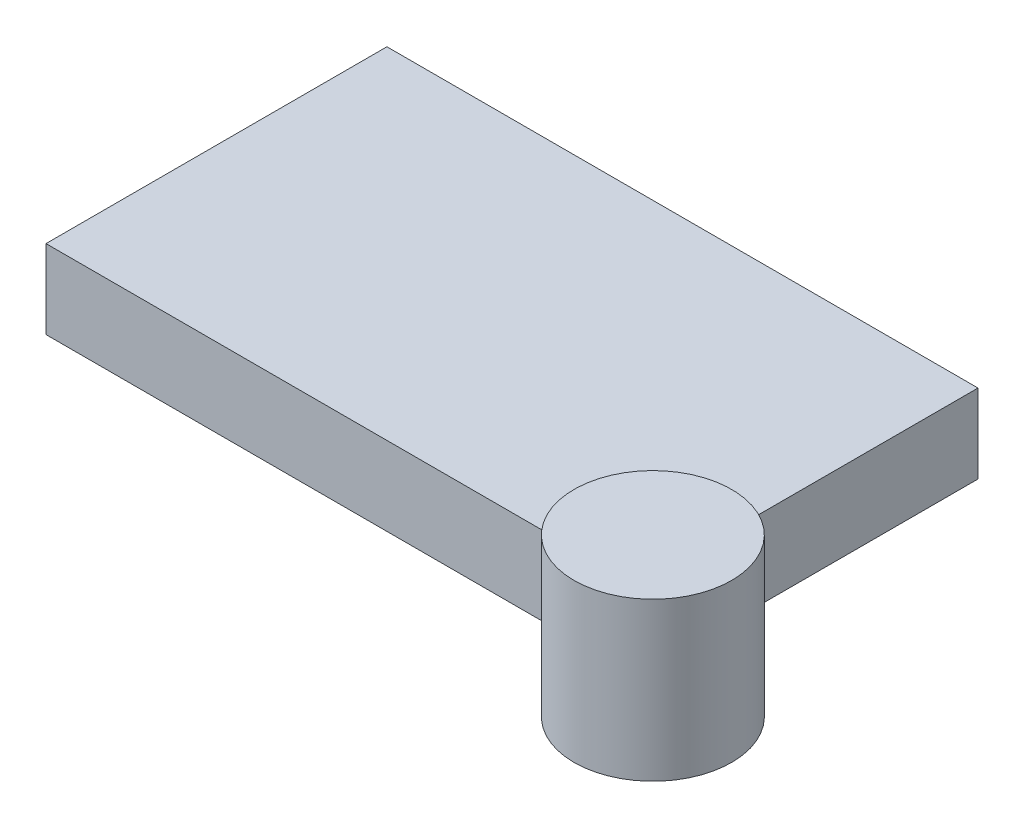
ISO-10303-21;
HEADER;
FILE_DESCRIPTION(('STEP AP214'),'2;1');
FILE_NAME('part.step','',(''),(''),'','','');
FILE_SCHEMA(('AUTOMOTIVE_DESIGN { 1 0 10303 214 1 1 1 1 }'));
ENDSEC;
DATA;
#1=APPLICATION_CONTEXT('core data for automotive mechanical design processes');
#2=APPLICATION_PROTOCOL_DEFINITION('international standard','automotive_design',2000,#1);
#3=PRODUCT_CONTEXT('',#1,'mechanical');
#4=PRODUCT('Part','Part','',(#3));
#5=PRODUCT_RELATED_PRODUCT_CATEGORY('part','',(#4));
#6=PRODUCT_DEFINITION_FORMATION('','',#4);
#7=PRODUCT_DEFINITION_CONTEXT('part definition',#1,'design');
#8=PRODUCT_DEFINITION('design','',#6,#7);
#9=PRODUCT_DEFINITION_SHAPE('','',#8);
#10=(LENGTH_UNIT() NAMED_UNIT(*) SI_UNIT(.MILLI.,.METRE.));
#11=(NAMED_UNIT(*) PLANE_ANGLE_UNIT() SI_UNIT($,.RADIAN.));
#12=(NAMED_UNIT(*) SI_UNIT($,.STERADIAN.) SOLID_ANGLE_UNIT());
#13=UNCERTAINTY_MEASURE_WITH_UNIT(LENGTH_MEASURE(1.E-05),#10,'distance_accuracy_value','');
#14=(GEOMETRIC_REPRESENTATION_CONTEXT(3) GLOBAL_UNCERTAINTY_ASSIGNED_CONTEXT((#13)) GLOBAL_UNIT_ASSIGNED_CONTEXT((#10,
#11,#12)) REPRESENTATION_CONTEXT('',''));
#15=CARTESIAN_POINT('',(0.,0.,0.));
#16=DIRECTION('',(0.,0.,1.));
#17=DIRECTION('',(1.,0.,0.));
#18=AXIS2_PLACEMENT_3D('',#15,#16,#17);
#19=CARTESIAN_POINT('',(35.,10.,5.));
#20=DIRECTION('',(0.,-1.,0.));
#21=DIRECTION('',(0.,0.,-1.));
#22=AXIS2_PLACEMENT_3D('',#19,#20,#21);
#23=CYLINDRICAL_SURFACE('',#22,5.);
#24=DIRECTION('',(0.,-1.,0.));
#25=VECTOR('',#24,1.);
#26=CARTESIAN_POINT('',(34.7421693733974,10.,0.00665208822920715));
#27=LINE('',#26,#25);
#28=CARTESIAN_POINT('',(34.7421693733974,7.5,0.00665208822920715));
#29=VERTEX_POINT('',#28);
#30=CARTESIAN_POINT('',(34.7421693733974,2.5,0.00665208822920715));
#31=VERTEX_POINT('',#30);
#32=EDGE_CURVE('E51',#29,#31,#27,.T.);
#33=ORIENTED_EDGE('',*,*,#32,.F.);
#34=CARTESIAN_POINT('',(35.,7.5,5.));
#35=DIRECTION('',(0.,1.,0.));
#36=DIRECTION('',(0.,0.,1.));
#37=AXIS2_PLACEMENT_3D('',#34,#35,#36);
#38=CIRCLE('',#37,5.);
#39=CARTESIAN_POINT('',(30.0555178321658,7.5,5.74303168974751));
#40=VERTEX_POINT('',#39);
#41=EDGE_CURVE('E11',#29,#40,#38,.T.);
#42=ORIENTED_EDGE('',*,*,#41,.T.);
#43=DIRECTION('',(0.,-1.,0.));
#44=VECTOR('',#43,1.);
#45=CARTESIAN_POINT('',(30.0555178321658,10.,5.74303168974751));
#46=LINE('',#45,#44);
#47=CARTESIAN_POINT('',(30.0555178321658,2.5,5.74303168974751));
#48=VERTEX_POINT('',#47);
#49=EDGE_CURVE('E41',#48,#40,#46,.F.);
#50=ORIENTED_EDGE('',*,*,#49,.F.);
#51=CARTESIAN_POINT('',(35.,2.5,5.));
#52=DIRECTION('',(0.,1.,0.));
#53=DIRECTION('',(0.,0.,1.));
#54=AXIS2_PLACEMENT_3D('',#51,#52,#53);
#55=CIRCLE('',#54,5.);
#56=EDGE_CURVE('E111',#31,#48,#55,.T.);
#57=ORIENTED_EDGE('',*,*,#56,.F.);
#58=EDGE_LOOP('',(#33,#42,#50,#57));
#59=FACE_BOUND('',#58,.T.);
#60=CARTESIAN_POINT('',(35.,10.,5.));
#61=DIRECTION('',(0.,1.,0.));
#62=DIRECTION('',(0.,0.,1.));
#63=AXIS2_PLACEMENT_3D('',#60,#61,#62);
#64=CIRCLE('',#63,5.);
#65=CARTESIAN_POINT('',(35.,10.,10.));
#66=VERTEX_POINT('',#65);
#67=EDGE_CURVE('E103',#66,#66,#64,.T.);
#68=ORIENTED_EDGE('',*,*,#67,.F.);
#69=EDGE_LOOP('',(#68));
#70=FACE_BOUND('',#69,.T.);
#71=CARTESIAN_POINT('',(35.,0.,5.));
#72=DIRECTION('',(0.,1.,0.));
#73=DIRECTION('',(0.,0.,1.));
#74=AXIS2_PLACEMENT_3D('',#71,#72,#73);
#75=CIRCLE('',#74,5.);
#76=CARTESIAN_POINT('',(35.,0.,10.));
#77=VERTEX_POINT('',#76);
#78=EDGE_CURVE('E99',#77,#77,#75,.T.);
#79=ORIENTED_EDGE('',*,*,#78,.T.);
#80=EDGE_LOOP('',(#79));
#81=FACE_BOUND('',#80,.T.);
#82=ADVANCED_FACE('F34',(#59,#70,#81),#23,.T.);
#83=CARTESIAN_POINT('',(35.,10.,5.));
#84=DIRECTION('',(0.,1.,0.));
#85=DIRECTION('',(0.,0.,1.));
#86=AXIS2_PLACEMENT_3D('',#83,#84,#85);
#87=PLANE('',#86);
#88=ORIENTED_EDGE('',*,*,#67,.T.);
#89=EDGE_LOOP('',(#88));
#90=FACE_BOUND('',#89,.T.);
#91=ADVANCED_FACE('F144',(#90),#87,.T.);
#92=CARTESIAN_POINT('',(35.,0.,5.));
#93=DIRECTION('',(0.,1.,0.));
#94=DIRECTION('',(0.,0.,1.));
#95=AXIS2_PLACEMENT_3D('',#92,#93,#94);
#96=PLANE('',#95);
#97=ORIENTED_EDGE('',*,*,#78,.F.);
#98=EDGE_LOOP('',(#97));
#99=FACE_BOUND('',#98,.T.);
#100=ADVANCED_FACE('F148',(#99),#96,.F.);
#101=CARTESIAN_POINT('',(-2.75181442294586,7.5,5.74303168974751));
#102=DIRECTION('',(0.,0.,-1.));
#103=DIRECTION('',(-1.,0.,0.));
#104=AXIS2_PLACEMENT_3D('',#101,#102,#103);
#105=PLANE('',#104);
#106=DIRECTION('',(1.,0.,0.));
#107=VECTOR('',#106,1.);
#108=CARTESIAN_POINT('',(-2.75181442294586,2.5,5.74303168974751));
#109=LINE('',#108,#107);
#110=CARTESIAN_POINT('',(-2.75181442294586,2.5,5.74303168974751));
#111=VERTEX_POINT('',#110);
#112=EDGE_CURVE('E124',#111,#48,#109,.T.);
#113=ORIENTED_EDGE('',*,*,#112,.T.);
#114=ORIENTED_EDGE('',*,*,#49,.T.);
#115=DIRECTION('',(1.,0.,0.));
#116=VECTOR('',#115,1.);
#117=CARTESIAN_POINT('',(-2.75181442294586,7.5,5.74303168974751));
#118=LINE('',#117,#116);
#119=CARTESIAN_POINT('',(-2.75181442294586,7.5,5.74303168974751));
#120=VERTEX_POINT('',#119);
#121=EDGE_CURVE('E76',#120,#40,#118,.T.);
#122=ORIENTED_EDGE('',*,*,#121,.F.);
#123=DIRECTION('',(0.,-1.,0.));
#124=VECTOR('',#123,1.);
#125=CARTESIAN_POINT('',(-2.75181442294586,7.5,5.74303168974751));
#126=LINE('',#125,#124);
#127=EDGE_CURVE('E81',#120,#111,#126,.T.);
#128=ORIENTED_EDGE('',*,*,#127,.T.);
#129=EDGE_LOOP('',(#113,#114,#122,#128));
#130=FACE_BOUND('',#129,.T.);
#131=ADVANCED_FACE('F79',(#130),#105,.F.);
#132=CARTESIAN_POINT('',(34.7421693733974,7.5,-15.8819058800229));
#133=DIRECTION('',(-1.,0.,0.));
#134=DIRECTION('',(0.,0.,1.));
#135=AXIS2_PLACEMENT_3D('',#132,#133,#134);
#136=PLANE('',#135);
#137=DIRECTION('',(0.,0.,-1.));
#138=VECTOR('',#137,1.);
#139=CARTESIAN_POINT('',(34.7421693733974,7.5,-15.8819058800229));
#140=LINE('',#139,#138);
#141=CARTESIAN_POINT('',(34.7421693733974,7.5,-15.8819058800229));
#142=VERTEX_POINT('',#141);
#143=EDGE_CURVE('E84',#29,#142,#140,.T.);
#144=ORIENTED_EDGE('',*,*,#143,.F.);
#145=ORIENTED_EDGE('',*,*,#32,.T.);
#146=DIRECTION('',(0.,0.,-1.));
#147=VECTOR('',#146,1.);
#148=CARTESIAN_POINT('',(34.7421693733974,2.5,-15.8819058800229));
#149=LINE('',#148,#147);
#150=CARTESIAN_POINT('',(34.7421693733974,2.5,-15.8819058800229));
#151=VERTEX_POINT('',#150);
#152=EDGE_CURVE('E120',#31,#151,#149,.T.);
#153=ORIENTED_EDGE('',*,*,#152,.T.);
#154=DIRECTION('',(0.,-1.,0.));
#155=VECTOR('',#154,1.);
#156=CARTESIAN_POINT('',(34.7421693733974,7.5,-15.8819058800229));
#157=LINE('',#156,#155);
#158=EDGE_CURVE('E100',#142,#151,#157,.T.);
#159=ORIENTED_EDGE('',*,*,#158,.F.);
#160=EDGE_LOOP('',(#144,#145,#153,#159));
#161=FACE_BOUND('',#160,.T.);
#162=ADVANCED_FACE('F118',(#161),#136,.F.);
#163=CARTESIAN_POINT('',(-2.75181442294586,7.5,-15.8819058800229));
#164=DIRECTION('',(1.,0.,0.));
#165=DIRECTION('',(0.,0.,-1.));
#166=AXIS2_PLACEMENT_3D('',#163,#164,#165);
#167=PLANE('',#166);
#168=DIRECTION('',(0.,0.,1.));
#169=VECTOR('',#168,1.);
#170=CARTESIAN_POINT('',(-2.75181442294586,2.5,-15.8819058800229));
#171=LINE('',#170,#169);
#172=CARTESIAN_POINT('',(-2.75181442294586,2.5,-15.8819058800229));
#173=VERTEX_POINT('',#172);
#174=EDGE_CURVE('E98',#173,#111,#171,.T.);
#175=ORIENTED_EDGE('',*,*,#174,.T.);
#176=ORIENTED_EDGE('',*,*,#127,.F.);
#177=DIRECTION('',(0.,0.,1.));
#178=VECTOR('',#177,1.);
#179=CARTESIAN_POINT('',(-2.75181442294586,7.5,-15.8819058800229));
#180=LINE('',#179,#178);
#181=CARTESIAN_POINT('',(-2.75181442294586,7.5,-15.8819058800229));
#182=VERTEX_POINT('',#181);
#183=EDGE_CURVE('E85',#182,#120,#180,.T.);
#184=ORIENTED_EDGE('',*,*,#183,.F.);
#185=DIRECTION('',(0.,-1.,0.));
#186=VECTOR('',#185,1.);
#187=CARTESIAN_POINT('',(-2.75181442294586,7.5,-15.8819058800229));
#188=LINE('',#187,#186);
#189=EDGE_CURVE('E106',#182,#173,#188,.T.);
#190=ORIENTED_EDGE('',*,*,#189,.T.);
#191=EDGE_LOOP('',(#175,#176,#184,#190));
#192=FACE_BOUND('',#191,.T.);
#193=ADVANCED_FACE('F96',(#192),#167,.F.);
#194=CARTESIAN_POINT('',(-2.75181442294586,7.5,-15.8819058800229));
#195=DIRECTION('',(0.,0.,1.));
#196=DIRECTION('',(1.,0.,0.));
#197=AXIS2_PLACEMENT_3D('',#194,#195,#196);
#198=PLANE('',#197);
#199=DIRECTION('',(-1.,0.,0.));
#200=VECTOR('',#199,1.);
#201=CARTESIAN_POINT('',(-2.75181442294586,2.5,-15.8819058800229));
#202=LINE('',#201,#200);
#203=EDGE_CURVE('E94',#151,#173,#202,.T.);
#204=ORIENTED_EDGE('',*,*,#203,.T.);
#205=ORIENTED_EDGE('',*,*,#189,.F.);
#206=DIRECTION('',(-1.,0.,0.));
#207=VECTOR('',#206,1.);
#208=CARTESIAN_POINT('',(-2.75181442294586,7.5,-15.8819058800229));
#209=LINE('',#208,#207);
#210=EDGE_CURVE('E90',#142,#182,#209,.T.);
#211=ORIENTED_EDGE('',*,*,#210,.F.);
#212=ORIENTED_EDGE('',*,*,#158,.T.);
#213=EDGE_LOOP('',(#204,#205,#211,#212));
#214=FACE_BOUND('',#213,.T.);
#215=ADVANCED_FACE('F132',(#214),#198,.F.);
#216=CARTESIAN_POINT('',(0.,7.5,0.));
#217=DIRECTION('',(0.,1.,0.));
#218=DIRECTION('',(0.,0.,1.));
#219=AXIS2_PLACEMENT_3D('',#216,#217,#218);
#220=PLANE('',#219);
#221=ORIENTED_EDGE('',*,*,#41,.F.);
#222=ORIENTED_EDGE('',*,*,#143,.T.);
#223=ORIENTED_EDGE('',*,*,#210,.T.);
#224=ORIENTED_EDGE('',*,*,#183,.T.);
#225=ORIENTED_EDGE('',*,*,#121,.T.);
#226=EDGE_LOOP('',(#221,#222,#223,#224,#225));
#227=FACE_BOUND('',#226,.T.);
#228=ADVANCED_FACE('F88',(#227),#220,.T.);
#229=CARTESIAN_POINT('',(0.,2.5,0.));
#230=DIRECTION('',(0.,1.,0.));
#231=DIRECTION('',(0.,0.,1.));
#232=AXIS2_PLACEMENT_3D('',#229,#230,#231);
#233=PLANE('',#232);
#234=ORIENTED_EDGE('',*,*,#152,.F.);
#235=ORIENTED_EDGE('',*,*,#56,.T.);
#236=ORIENTED_EDGE('',*,*,#112,.F.);
#237=ORIENTED_EDGE('',*,*,#174,.F.);
#238=ORIENTED_EDGE('',*,*,#203,.F.);
#239=EDGE_LOOP('',(#234,#235,#236,#237,#238));
#240=FACE_BOUND('',#239,.T.);
#241=ADVANCED_FACE('F123',(#240),#233,.F.);
#242=CLOSED_SHELL('',(#82,#91,#100,#131,#162,#193,#215,#228,#241));
#243=MANIFOLD_SOLID_BREP('B2',#242);
#244=ADVANCED_BREP_SHAPE_REPRESENTATION('',(#18,#243),#14);
#245=SHAPE_DEFINITION_REPRESENTATION(#9,#244);
ENDSEC;
END-ISO-10303-21;
